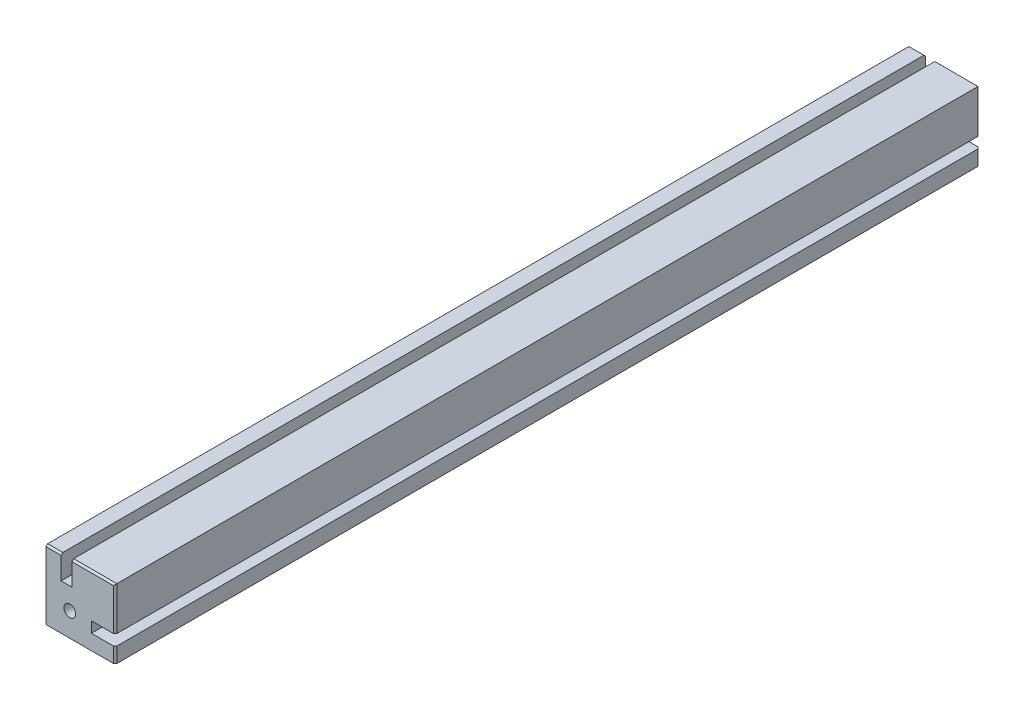
ISO-10303-21;
HEADER;
FILE_DESCRIPTION(('STEP AP214'),'2;1');
FILE_NAME('part.step','',(''),(''),'','','');
FILE_SCHEMA(('AUTOMOTIVE_DESIGN { 1 0 10303 214 1 1 1 1 }'));
ENDSEC;
DATA;
#1=APPLICATION_CONTEXT('core data for automotive mechanical design processes');
#2=APPLICATION_PROTOCOL_DEFINITION('international standard','automotive_design',2000,#1);
#3=PRODUCT_CONTEXT('',#1,'mechanical');
#4=PRODUCT('Part','Part','',(#3));
#5=PRODUCT_RELATED_PRODUCT_CATEGORY('part','',(#4));
#6=PRODUCT_DEFINITION_FORMATION('','',#4);
#7=PRODUCT_DEFINITION_CONTEXT('part definition',#1,'design');
#8=PRODUCT_DEFINITION('design','',#6,#7);
#9=PRODUCT_DEFINITION_SHAPE('','',#8);
#10=(LENGTH_UNIT() NAMED_UNIT(*) SI_UNIT(.MILLI.,.METRE.));
#11=(NAMED_UNIT(*) PLANE_ANGLE_UNIT() SI_UNIT($,.RADIAN.));
#12=(NAMED_UNIT(*) SI_UNIT($,.STERADIAN.) SOLID_ANGLE_UNIT());
#13=UNCERTAINTY_MEASURE_WITH_UNIT(LENGTH_MEASURE(1.E-05),#10,'distance_accuracy_value','');
#14=(GEOMETRIC_REPRESENTATION_CONTEXT(3) GLOBAL_UNCERTAINTY_ASSIGNED_CONTEXT((#13)) GLOBAL_UNIT_ASSIGNED_CONTEXT((#10,
#11,#12)) REPRESENTATION_CONTEXT('',''));
#15=CARTESIAN_POINT('',(0.,0.,0.));
#16=DIRECTION('',(0.,0.,1.));
#17=DIRECTION('',(1.,0.,0.));
#18=AXIS2_PLACEMENT_3D('',#15,#16,#17);
#19=CARTESIAN_POINT('',(8.,8.,200.));
#20=DIRECTION('',(-1.,0.,0.));
#21=DIRECTION('',(0.,-1.,0.));
#22=AXIS2_PLACEMENT_3D('',#19,#20,#21);
#23=PLANE('',#22);
#24=DIRECTION('',(0.,0.,1.));
#25=VECTOR('',#24,1.);
#26=CARTESIAN_POINT('',(8.,-4.5,0.));
#27=LINE('',#26,#25);
#28=CARTESIAN_POINT('',(8.,-4.5,0.400000000000012));
#29=VERTEX_POINT('',#28);
#30=CARTESIAN_POINT('',(8.,-4.5,199.6));
#31=VERTEX_POINT('',#30);
#32=EDGE_CURVE('E204',#29,#31,#27,.T.);
#33=ORIENTED_EDGE('',*,*,#32,.T.);
#34=DIRECTION('',(0.,-1.,0.));
#35=VECTOR('',#34,1.);
#36=CARTESIAN_POINT('',(8.,-8.,199.6));
#37=LINE('',#36,#35);
#38=CARTESIAN_POINT('',(8.,-8.,199.6));
#39=VERTEX_POINT('',#38);
#40=EDGE_CURVE('E286',#31,#39,#37,.T.);
#41=ORIENTED_EDGE('',*,*,#40,.T.);
#42=DIRECTION('',(0.,0.,-1.));
#43=VECTOR('',#42,1.);
#44=CARTESIAN_POINT('',(8.,-8.,200.));
#45=LINE('',#44,#43);
#46=CARTESIAN_POINT('',(8.,-8.,0.400000000000011));
#47=VERTEX_POINT('',#46);
#48=EDGE_CURVE('E253',#39,#47,#45,.T.);
#49=ORIENTED_EDGE('',*,*,#48,.T.);
#50=DIRECTION('',(0.,1.,0.));
#51=VECTOR('',#50,1.);
#52=CARTESIAN_POINT('',(8.,8.,0.400000000000011));
#53=LINE('',#52,#51);
#54=EDGE_CURVE('E283',#47,#29,#53,.T.);
#55=ORIENTED_EDGE('',*,*,#54,.T.);
#56=EDGE_LOOP('',(#33,#41,#49,#55));
#57=FACE_BOUND('',#56,.T.);
#58=ADVANCED_FACE('F34',(#57),#23,.F.);
#59=CARTESIAN_POINT('',(-8.,8.,200.));
#60=DIRECTION('',(0.,-1.,0.));
#61=DIRECTION('',(0.,0.,-1.));
#62=AXIS2_PLACEMENT_3D('',#59,#60,#61);
#63=PLANE('',#62);
#64=DIRECTION('',(0.,0.,-1.));
#65=VECTOR('',#64,1.);
#66=CARTESIAN_POINT('',(-8.,8.,200.));
#67=LINE('',#66,#65);
#68=CARTESIAN_POINT('',(-8.,8.,199.6));
#69=VERTEX_POINT('',#68);
#70=CARTESIAN_POINT('',(-8.,8.,0.400000000000011));
#71=VERTEX_POINT('',#70);
#72=EDGE_CURVE('E262',#69,#71,#67,.T.);
#73=ORIENTED_EDGE('',*,*,#72,.F.);
#74=DIRECTION('',(1.,0.,0.));
#75=VECTOR('',#74,1.);
#76=CARTESIAN_POINT('',(-4.5,8.,199.6));
#77=LINE('',#76,#75);
#78=CARTESIAN_POINT('',(-4.5,8.,199.6));
#79=VERTEX_POINT('',#78);
#80=EDGE_CURVE('E316',#69,#79,#77,.T.);
#81=ORIENTED_EDGE('',*,*,#80,.T.);
#82=DIRECTION('',(0.,0.,1.));
#83=VECTOR('',#82,1.);
#84=CARTESIAN_POINT('',(-4.5,8.,0.));
#85=LINE('',#84,#83);
#86=CARTESIAN_POINT('',(-4.5,8.,0.400000000000011));
#87=VERTEX_POINT('',#86);
#88=EDGE_CURVE('E209',#87,#79,#85,.T.);
#89=ORIENTED_EDGE('',*,*,#88,.F.);
#90=DIRECTION('',(-1.,0.,0.));
#91=VECTOR('',#90,1.);
#92=CARTESIAN_POINT('',(-8.,8.,0.400000000000011));
#93=LINE('',#92,#91);
#94=EDGE_CURVE('E313',#87,#71,#93,.T.);
#95=ORIENTED_EDGE('',*,*,#94,.T.);
#96=EDGE_LOOP('',(#73,#81,#89,#95));
#97=FACE_BOUND('',#96,.T.);
#98=ADVANCED_FACE('F389',(#97),#63,.F.);
#99=DIRECTION('',(0.,0.,-1.));
#100=VECTOR('',#99,1.);
#101=CARTESIAN_POINT('',(8.,8.,200.));
#102=LINE('',#101,#100);
#103=CARTESIAN_POINT('',(8.,8.,199.6));
#104=VERTEX_POINT('',#103);
#105=CARTESIAN_POINT('',(8.,8.,0.400000000000011));
#106=VERTEX_POINT('',#105);
#107=EDGE_CURVE('E265',#104,#106,#102,.T.);
#108=ORIENTED_EDGE('',*,*,#107,.F.);
#109=DIRECTION('',(0.,-1.,0.));
#110=VECTOR('',#109,1.);
#111=CARTESIAN_POINT('',(8.,-2.,199.6));
#112=LINE('',#111,#110);
#113=CARTESIAN_POINT('',(8.,-2.,199.6));
#114=VERTEX_POINT('',#113);
#115=EDGE_CURVE('E294',#104,#114,#112,.T.);
#116=ORIENTED_EDGE('',*,*,#115,.T.);
#117=DIRECTION('',(0.,0.,1.));
#118=VECTOR('',#117,1.);
#119=CARTESIAN_POINT('',(8.,-2.,0.));
#120=LINE('',#119,#118);
#121=CARTESIAN_POINT('',(8.,-2.,0.400000000000011));
#122=VERTEX_POINT('',#121);
#123=EDGE_CURVE('E229',#122,#114,#120,.T.);
#124=ORIENTED_EDGE('',*,*,#123,.F.);
#125=DIRECTION('',(0.,1.,0.));
#126=VECTOR('',#125,1.);
#127=CARTESIAN_POINT('',(8.,8.,0.400000000000011));
#128=LINE('',#127,#126);
#129=EDGE_CURVE('E292',#122,#106,#128,.T.);
#130=ORIENTED_EDGE('',*,*,#129,.T.);
#131=EDGE_LOOP('',(#108,#116,#124,#130));
#132=FACE_BOUND('',#131,.T.);
#133=ADVANCED_FACE('F407',(#132),#23,.F.);
#134=DIRECTION('',(0.,0.,1.));
#135=VECTOR('',#134,1.);
#136=CARTESIAN_POINT('',(-2.,8.,0.));
#137=LINE('',#136,#135);
#138=CARTESIAN_POINT('',(-2.,8.,0.400000000000011));
#139=VERTEX_POINT('',#138);
#140=CARTESIAN_POINT('',(-2.,8.,199.6));
#141=VERTEX_POINT('',#140);
#142=EDGE_CURVE('E213',#139,#141,#137,.T.);
#143=ORIENTED_EDGE('',*,*,#142,.T.);
#144=DIRECTION('',(1.,0.,0.));
#145=VECTOR('',#144,1.);
#146=CARTESIAN_POINT('',(8.,8.,199.6));
#147=LINE('',#146,#145);
#148=EDGE_CURVE('E307',#141,#104,#147,.T.);
#149=ORIENTED_EDGE('',*,*,#148,.T.);
#150=ORIENTED_EDGE('',*,*,#107,.T.);
#151=DIRECTION('',(-1.,0.,0.));
#152=VECTOR('',#151,1.);
#153=CARTESIAN_POINT('',(-8.,8.,0.400000000000011));
#154=LINE('',#153,#152);
#155=EDGE_CURVE('E304',#106,#139,#154,.T.);
#156=ORIENTED_EDGE('',*,*,#155,.T.);
#157=EDGE_LOOP('',(#143,#149,#150,#156));
#158=FACE_BOUND('',#157,.T.);
#159=ADVANCED_FACE('F403',(#158),#63,.F.);
#160=CARTESIAN_POINT('',(-8.,8.,200.));
#161=DIRECTION('',(1.,0.,0.));
#162=DIRECTION('',(0.,1.,0.));
#163=AXIS2_PLACEMENT_3D('',#160,#161,#162);
#164=PLANE('',#163);
#165=DIRECTION('',(0.,-1.,0.));
#166=VECTOR('',#165,1.);
#167=CARTESIAN_POINT('',(-8.,8.,200.));
#168=LINE('',#167,#166);
#169=CARTESIAN_POINT('',(-8.,7.59999999999999,200.));
#170=VERTEX_POINT('',#169);
#171=CARTESIAN_POINT('',(-8.,-8.,200.));
#172=VERTEX_POINT('',#171);
#173=EDGE_CURVE('E247',#170,#172,#168,.T.);
#174=ORIENTED_EDGE('',*,*,#173,.F.);
#175=DIRECTION('',(0.,0.707106781186548,-0.707106781186548));
#176=VECTOR('',#175,1.);
#177=CARTESIAN_POINT('',(-8.,7.59999999999999,200.));
#178=LINE('',#177,#176);
#179=EDGE_CURVE('E311',#170,#69,#178,.T.);
#180=ORIENTED_EDGE('',*,*,#179,.T.);
#181=ORIENTED_EDGE('',*,*,#72,.T.);
#182=DIRECTION('',(0.,0.707106781186548,0.707106781186548));
#183=VECTOR('',#182,1.);
#184=CARTESIAN_POINT('',(-8.,8.,0.400000000000011));
#185=LINE('',#184,#183);
#186=CARTESIAN_POINT('',(-8.,7.59999999999999,0.));
#187=VERTEX_POINT('',#186);
#188=EDGE_CURVE('E309',#71,#187,#185,.F.);
#189=ORIENTED_EDGE('',*,*,#188,.T.);
#190=DIRECTION('',(0.,-1.,0.));
#191=VECTOR('',#190,1.);
#192=CARTESIAN_POINT('',(-8.,8.,0.));
#193=LINE('',#192,#191);
#194=CARTESIAN_POINT('',(-8.,-8.,0.));
#195=VERTEX_POINT('',#194);
#196=EDGE_CURVE('E212',#187,#195,#193,.T.);
#197=ORIENTED_EDGE('',*,*,#196,.T.);
#198=DIRECTION('',(0.,0.,-1.));
#199=VECTOR('',#198,1.);
#200=CARTESIAN_POINT('',(-8.,-8.,200.));
#201=LINE('',#200,#199);
#202=EDGE_CURVE('E259',#172,#195,#201,.T.);
#203=ORIENTED_EDGE('',*,*,#202,.F.);
#204=EDGE_LOOP('',(#174,#180,#181,#189,#197,#203));
#205=FACE_BOUND('',#204,.T.);
#206=ADVANCED_FACE('F378',(#205),#164,.F.);
#207=CARTESIAN_POINT('',(-8.,-8.,200.));
#208=DIRECTION('',(0.,1.,0.));
#209=DIRECTION('',(0.,0.,1.));
#210=AXIS2_PLACEMENT_3D('',#207,#208,#209);
#211=PLANE('',#210);
#212=ORIENTED_EDGE('',*,*,#48,.F.);
#213=DIRECTION('',(-0.707106781186548,0.,0.707106781186548));
#214=VECTOR('',#213,1.);
#215=CARTESIAN_POINT('',(7.59999999999999,-8.,200.));
#216=LINE('',#215,#214);
#217=CARTESIAN_POINT('',(7.59999999999999,-8.,200.));
#218=VERTEX_POINT('',#217);
#219=EDGE_CURVE('E290',#39,#218,#216,.T.);
#220=ORIENTED_EDGE('',*,*,#219,.T.);
#221=DIRECTION('',(1.,0.,0.));
#222=VECTOR('',#221,1.);
#223=CARTESIAN_POINT('',(-8.,-8.,200.));
#224=LINE('',#223,#222);
#225=EDGE_CURVE('E249',#172,#218,#224,.T.);
#226=ORIENTED_EDGE('',*,*,#225,.F.);
#227=ORIENTED_EDGE('',*,*,#202,.T.);
#228=DIRECTION('',(1.,0.,0.));
#229=VECTOR('',#228,1.);
#230=CARTESIAN_POINT('',(-8.,-8.,0.));
#231=LINE('',#230,#229);
#232=CARTESIAN_POINT('',(7.59999999999999,-8.,0.));
#233=VERTEX_POINT('',#232);
#234=EDGE_CURVE('E250',#195,#233,#231,.T.);
#235=ORIENTED_EDGE('',*,*,#234,.T.);
#236=DIRECTION('',(-0.707106781186548,0.,-0.707106781186548));
#237=VECTOR('',#236,1.);
#238=CARTESIAN_POINT('',(8.,-8.,0.40000000000001));
#239=LINE('',#238,#237);
#240=EDGE_CURVE('E288',#233,#47,#239,.F.);
#241=ORIENTED_EDGE('',*,*,#240,.T.);
#242=EDGE_LOOP('',(#212,#220,#226,#227,#235,#241));
#243=FACE_BOUND('',#242,.T.);
#244=ADVANCED_FACE('F366',(#243),#211,.F.);
#245=CARTESIAN_POINT('',(0.,0.,200.));
#246=DIRECTION('',(0.,0.,1.));
#247=DIRECTION('',(1.,0.,0.));
#248=AXIS2_PLACEMENT_3D('',#245,#246,#247);
#249=PLANE('',#248);
#250=CARTESIAN_POINT('',(-2.5,-2.5,200.));
#251=DIRECTION('',(0.,0.,1.));
#252=DIRECTION('',(1.,0.,0.));
#253=AXIS2_PLACEMENT_3D('',#250,#251,#252);
#254=CIRCLE('',#253,1.34999999999999);
#255=CARTESIAN_POINT('',(-1.15000000000001,-2.5,200.));
#256=VERTEX_POINT('',#255);
#257=EDGE_CURVE('E182',#256,#256,#254,.T.);
#258=ORIENTED_EDGE('',*,*,#257,.F.);
#259=EDGE_LOOP('',(#258));
#260=FACE_BOUND('',#259,.T.);
#261=ORIENTED_EDGE('',*,*,#225,.T.);
#262=DIRECTION('',(0.,1.,0.));
#263=VECTOR('',#262,1.);
#264=CARTESIAN_POINT('',(7.59999999999999,-4.5,200.));
#265=LINE('',#264,#263);
#266=CARTESIAN_POINT('',(7.59999999999999,-4.5,200.));
#267=VERTEX_POINT('',#266);
#268=EDGE_CURVE('E276',#218,#267,#265,.T.);
#269=ORIENTED_EDGE('',*,*,#268,.T.);
#270=DIRECTION('',(1.,0.,0.));
#271=VECTOR('',#270,1.);
#272=CARTESIAN_POINT('',(8.,-4.5,200.));
#273=LINE('',#272,#271);
#274=CARTESIAN_POINT('',(2.5,-4.5,200.));
#275=VERTEX_POINT('',#274);
#276=EDGE_CURVE('E223',#275,#267,#273,.T.);
#277=ORIENTED_EDGE('',*,*,#276,.F.);
#278=DIRECTION('',(0.,-1.,0.));
#279=VECTOR('',#278,1.);
#280=CARTESIAN_POINT('',(2.5,-4.5,200.));
#281=LINE('',#280,#279);
#282=CARTESIAN_POINT('',(2.5,-2.,200.));
#283=VERTEX_POINT('',#282);
#284=EDGE_CURVE('E232',#283,#275,#281,.T.);
#285=ORIENTED_EDGE('',*,*,#284,.F.);
#286=DIRECTION('',(-1.,0.,0.));
#287=VECTOR('',#286,1.);
#288=CARTESIAN_POINT('',(8.,-2.,200.));
#289=LINE('',#288,#287);
#290=CARTESIAN_POINT('',(7.59999999999999,-2.,200.));
#291=VERTEX_POINT('',#290);
#292=EDGE_CURVE('E230',#291,#283,#289,.T.);
#293=ORIENTED_EDGE('',*,*,#292,.F.);
#294=DIRECTION('',(0.,1.,0.));
#295=VECTOR('',#294,1.);
#296=CARTESIAN_POINT('',(7.59999999999999,8.,200.));
#297=LINE('',#296,#295);
#298=CARTESIAN_POINT('',(7.59999999999999,7.59999999999999,200.));
#299=VERTEX_POINT('',#298);
#300=EDGE_CURVE('E273',#291,#299,#297,.T.);
#301=ORIENTED_EDGE('',*,*,#300,.T.);
#302=DIRECTION('',(-1.,0.,0.));
#303=VECTOR('',#302,1.);
#304=CARTESIAN_POINT('',(-2.,7.59999999999999,200.));
#305=LINE('',#304,#303);
#306=CARTESIAN_POINT('',(-2.,7.59999999999999,200.));
#307=VERTEX_POINT('',#306);
#308=EDGE_CURVE('E271',#299,#307,#305,.T.);
#309=ORIENTED_EDGE('',*,*,#308,.T.);
#310=DIRECTION('',(0.,1.,0.));
#311=VECTOR('',#310,1.);
#312=CARTESIAN_POINT('',(-2.,8.,200.));
#313=LINE('',#312,#311);
#314=CARTESIAN_POINT('',(-2.,2.5,200.));
#315=VERTEX_POINT('',#314);
#316=EDGE_CURVE('E195',#315,#307,#313,.T.);
#317=ORIENTED_EDGE('',*,*,#316,.F.);
#318=DIRECTION('',(1.,0.,0.));
#319=VECTOR('',#318,1.);
#320=CARTESIAN_POINT('',(-4.5,2.5,200.));
#321=LINE('',#320,#319);
#322=CARTESIAN_POINT('',(-4.5,2.5,200.));
#323=VERTEX_POINT('',#322);
#324=EDGE_CURVE('E203',#323,#315,#321,.T.);
#325=ORIENTED_EDGE('',*,*,#324,.F.);
#326=DIRECTION('',(0.,-1.,0.));
#327=VECTOR('',#326,1.);
#328=CARTESIAN_POINT('',(-4.5,8.,200.));
#329=LINE('',#328,#327);
#330=CARTESIAN_POINT('',(-4.5,7.59999999999999,200.));
#331=VERTEX_POINT('',#330);
#332=EDGE_CURVE('E201',#331,#323,#329,.T.);
#333=ORIENTED_EDGE('',*,*,#332,.F.);
#334=DIRECTION('',(-1.,0.,0.));
#335=VECTOR('',#334,1.);
#336=CARTESIAN_POINT('',(-8.,7.59999999999999,200.));
#337=LINE('',#336,#335);
#338=EDGE_CURVE('E268',#331,#170,#337,.T.);
#339=ORIENTED_EDGE('',*,*,#338,.T.);
#340=ORIENTED_EDGE('',*,*,#173,.T.);
#341=EDGE_LOOP('',(#261,#269,#277,#285,#293,#301,#309,#317,#325,#333,#339,#340));
#342=FACE_BOUND('',#341,.T.);
#343=ADVANCED_FACE('F352',(#260,#342),#249,.T.);
#344=CARTESIAN_POINT('',(0.,0.,0.));
#345=DIRECTION('',(0.,0.,1.));
#346=DIRECTION('',(1.,0.,0.));
#347=AXIS2_PLACEMENT_3D('',#344,#345,#346);
#348=PLANE('',#347);
#349=CARTESIAN_POINT('',(-2.5,-2.5,0.));
#350=DIRECTION('',(0.,0.,-1.));
#351=DIRECTION('',(-1.,0.,0.));
#352=AXIS2_PLACEMENT_3D('',#349,#350,#351);
#353=CIRCLE('',#352,1.34999999999999);
#354=CARTESIAN_POINT('',(-3.84999999999999,-2.5,0.));
#355=VERTEX_POINT('',#354);
#356=EDGE_CURVE('E181',#355,#355,#353,.T.);
#357=ORIENTED_EDGE('',*,*,#356,.F.);
#358=EDGE_LOOP('',(#357));
#359=FACE_BOUND('',#358,.T.);
#360=DIRECTION('',(1.,0.,0.));
#361=VECTOR('',#360,1.);
#362=CARTESIAN_POINT('',(8.,-4.5,0.));
#363=LINE('',#362,#361);
#364=CARTESIAN_POINT('',(2.5,-4.5,0.));
#365=VERTEX_POINT('',#364);
#366=CARTESIAN_POINT('',(7.59999999999999,-4.5,0.));
#367=VERTEX_POINT('',#366);
#368=EDGE_CURVE('E226',#365,#367,#363,.T.);
#369=ORIENTED_EDGE('',*,*,#368,.T.);
#370=DIRECTION('',(0.,-1.,0.));
#371=VECTOR('',#370,1.);
#372=CARTESIAN_POINT('',(7.59999999999999,0.,0.));
#373=LINE('',#372,#371);
#374=EDGE_CURVE('E11',#367,#233,#373,.T.);
#375=ORIENTED_EDGE('',*,*,#374,.T.);
#376=ORIENTED_EDGE('',*,*,#234,.F.);
#377=ORIENTED_EDGE('',*,*,#196,.F.);
#378=DIRECTION('',(1.,0.,0.));
#379=VECTOR('',#378,1.);
#380=CARTESIAN_POINT('',(0.,7.59999999999999,0.));
#381=LINE('',#380,#379);
#382=CARTESIAN_POINT('',(-4.5,7.59999999999999,0.));
#383=VERTEX_POINT('',#382);
#384=EDGE_CURVE('E58',#187,#383,#381,.T.);
#385=ORIENTED_EDGE('',*,*,#384,.T.);
#386=DIRECTION('',(0.,-1.,0.));
#387=VECTOR('',#386,1.);
#388=CARTESIAN_POINT('',(-4.5,8.,0.));
#389=LINE('',#388,#387);
#390=CARTESIAN_POINT('',(-4.5,2.5,0.));
#391=VERTEX_POINT('',#390);
#392=EDGE_CURVE('E192',#383,#391,#389,.T.);
#393=ORIENTED_EDGE('',*,*,#392,.T.);
#394=DIRECTION('',(1.,0.,0.));
#395=VECTOR('',#394,1.);
#396=CARTESIAN_POINT('',(-4.5,2.5,0.));
#397=LINE('',#396,#395);
#398=CARTESIAN_POINT('',(-2.,2.5,0.));
#399=VERTEX_POINT('',#398);
#400=EDGE_CURVE('E194',#391,#399,#397,.T.);
#401=ORIENTED_EDGE('',*,*,#400,.T.);
#402=DIRECTION('',(0.,1.,0.));
#403=VECTOR('',#402,1.);
#404=CARTESIAN_POINT('',(-2.,8.,0.));
#405=LINE('',#404,#403);
#406=CARTESIAN_POINT('',(-2.,7.59999999999999,0.));
#407=VERTEX_POINT('',#406);
#408=EDGE_CURVE('E198',#399,#407,#405,.T.);
#409=ORIENTED_EDGE('',*,*,#408,.T.);
#410=DIRECTION('',(1.,0.,0.));
#411=VECTOR('',#410,1.);
#412=CARTESIAN_POINT('',(0.,7.59999999999999,0.));
#413=LINE('',#412,#411);
#414=CARTESIAN_POINT('',(7.59999999999999,7.59999999999999,0.));
#415=VERTEX_POINT('',#414);
#416=EDGE_CURVE('E44',#407,#415,#413,.T.);
#417=ORIENTED_EDGE('',*,*,#416,.T.);
#418=DIRECTION('',(0.,-1.,0.));
#419=VECTOR('',#418,1.);
#420=CARTESIAN_POINT('',(7.59999999999999,0.,0.));
#421=LINE('',#420,#419);
#422=CARTESIAN_POINT('',(7.59999999999999,-2.,0.));
#423=VERTEX_POINT('',#422);
#424=EDGE_CURVE('E323',#415,#423,#421,.T.);
#425=ORIENTED_EDGE('',*,*,#424,.T.);
#426=DIRECTION('',(-1.,0.,0.));
#427=VECTOR('',#426,1.);
#428=CARTESIAN_POINT('',(8.,-2.,0.));
#429=LINE('',#428,#427);
#430=CARTESIAN_POINT('',(2.5,-2.,0.));
#431=VERTEX_POINT('',#430);
#432=EDGE_CURVE('E220',#423,#431,#429,.T.);
#433=ORIENTED_EDGE('',*,*,#432,.T.);
#434=DIRECTION('',(0.,-1.,0.));
#435=VECTOR('',#434,1.);
#436=CARTESIAN_POINT('',(2.5,-4.5,0.));
#437=LINE('',#436,#435);
#438=EDGE_CURVE('E222',#431,#365,#437,.T.);
#439=ORIENTED_EDGE('',*,*,#438,.T.);
#440=EDGE_LOOP('',(#369,#375,#376,#377,#385,#393,#401,#409,#417,#425,#433,#439));
#441=FACE_BOUND('',#440,.T.);
#442=ADVANCED_FACE('F340',(#359,#441),#348,.F.);
#443=CARTESIAN_POINT('',(8.,-4.5,0.));
#444=DIRECTION('',(0.,-1.,0.));
#445=DIRECTION('',(1.,0.,0.));
#446=AXIS2_PLACEMENT_3D('',#443,#444,#445);
#447=PLANE('',#446);
#448=ORIENTED_EDGE('',*,*,#276,.T.);
#449=DIRECTION('',(0.707106781186548,0.,-0.707106781186548));
#450=VECTOR('',#449,1.);
#451=CARTESIAN_POINT('',(7.59999999999999,-4.5,200.));
#452=LINE('',#451,#450);
#453=EDGE_CURVE('E281',#267,#31,#452,.T.);
#454=ORIENTED_EDGE('',*,*,#453,.T.);
#455=ORIENTED_EDGE('',*,*,#32,.F.);
#456=DIRECTION('',(0.707106781186548,0.,0.707106781186548));
#457=VECTOR('',#456,1.);
#458=CARTESIAN_POINT('',(8.,-4.5,0.400000000000011));
#459=LINE('',#458,#457);
#460=EDGE_CURVE('E279',#29,#367,#459,.F.);
#461=ORIENTED_EDGE('',*,*,#460,.T.);
#462=ORIENTED_EDGE('',*,*,#368,.F.);
#463=DIRECTION('',(0.,0.,1.));
#464=VECTOR('',#463,1.);
#465=CARTESIAN_POINT('',(2.5,-4.5,0.));
#466=LINE('',#465,#464);
#467=EDGE_CURVE('E240',#365,#275,#466,.T.);
#468=ORIENTED_EDGE('',*,*,#467,.T.);
#469=EDGE_LOOP('',(#448,#454,#455,#461,#462,#468));
#470=FACE_BOUND('',#469,.T.);
#471=ADVANCED_FACE('F355',(#470),#447,.F.);
#472=CARTESIAN_POINT('',(2.5,-4.5,0.));
#473=DIRECTION('',(-1.,0.,0.));
#474=DIRECTION('',(0.,0.,1.));
#475=AXIS2_PLACEMENT_3D('',#472,#473,#474);
#476=PLANE('',#475);
#477=ORIENTED_EDGE('',*,*,#284,.T.);
#478=ORIENTED_EDGE('',*,*,#467,.F.);
#479=ORIENTED_EDGE('',*,*,#438,.F.);
#480=DIRECTION('',(0.,0.,1.));
#481=VECTOR('',#480,1.);
#482=CARTESIAN_POINT('',(2.5,-2.,0.));
#483=LINE('',#482,#481);
#484=EDGE_CURVE('E242',#431,#283,#483,.T.);
#485=ORIENTED_EDGE('',*,*,#484,.T.);
#486=EDGE_LOOP('',(#477,#478,#479,#485));
#487=FACE_BOUND('',#486,.T.);
#488=ADVANCED_FACE('F349',(#487),#476,.F.);
#489=CARTESIAN_POINT('',(8.,-2.,0.));
#490=DIRECTION('',(0.,1.,0.));
#491=DIRECTION('',(-1.,0.,0.));
#492=AXIS2_PLACEMENT_3D('',#489,#490,#491);
#493=PLANE('',#492);
#494=ORIENTED_EDGE('',*,*,#123,.T.);
#495=DIRECTION('',(-0.707106781186548,0.,0.707106781186548));
#496=VECTOR('',#495,1.);
#497=CARTESIAN_POINT('',(7.59999999999999,-2.,200.));
#498=LINE('',#497,#496);
#499=EDGE_CURVE('E298',#114,#291,#498,.T.);
#500=ORIENTED_EDGE('',*,*,#499,.T.);
#501=ORIENTED_EDGE('',*,*,#292,.T.);
#502=ORIENTED_EDGE('',*,*,#484,.F.);
#503=ORIENTED_EDGE('',*,*,#432,.F.);
#504=DIRECTION('',(-0.707106781186548,0.,-0.707106781186548));
#505=VECTOR('',#504,1.);
#506=CARTESIAN_POINT('',(8.,-2.,0.400000000000011));
#507=LINE('',#506,#505);
#508=EDGE_CURVE('E296',#423,#122,#507,.F.);
#509=ORIENTED_EDGE('',*,*,#508,.T.);
#510=EDGE_LOOP('',(#494,#500,#501,#502,#503,#509));
#511=FACE_BOUND('',#510,.T.);
#512=ADVANCED_FACE('F344',(#511),#493,.F.);
#513=CARTESIAN_POINT('',(-4.5,8.,0.));
#514=DIRECTION('',(-1.,0.,0.));
#515=DIRECTION('',(0.,-1.,0.));
#516=AXIS2_PLACEMENT_3D('',#513,#514,#515);
#517=PLANE('',#516);
#518=ORIENTED_EDGE('',*,*,#88,.T.);
#519=DIRECTION('',(0.,-0.707106781186548,0.707106781186548));
#520=VECTOR('',#519,1.);
#521=CARTESIAN_POINT('',(-4.5,7.59999999999999,200.));
#522=LINE('',#521,#520);
#523=EDGE_CURVE('E320',#79,#331,#522,.T.);
#524=ORIENTED_EDGE('',*,*,#523,.T.);
#525=ORIENTED_EDGE('',*,*,#332,.T.);
#526=DIRECTION('',(0.,0.,1.));
#527=VECTOR('',#526,1.);
#528=CARTESIAN_POINT('',(-4.5,2.5,0.));
#529=LINE('',#528,#527);
#530=EDGE_CURVE('E200',#391,#323,#529,.T.);
#531=ORIENTED_EDGE('',*,*,#530,.F.);
#532=ORIENTED_EDGE('',*,*,#392,.F.);
#533=DIRECTION('',(0.,-0.707106781186548,-0.707106781186548));
#534=VECTOR('',#533,1.);
#535=CARTESIAN_POINT('',(-4.5,8.,0.400000000000012));
#536=LINE('',#535,#534);
#537=EDGE_CURVE('E318',#383,#87,#536,.F.);
#538=ORIENTED_EDGE('',*,*,#537,.T.);
#539=EDGE_LOOP('',(#518,#524,#525,#531,#532,#538));
#540=FACE_BOUND('',#539,.T.);
#541=ADVANCED_FACE('F384',(#540),#517,.F.);
#542=CARTESIAN_POINT('',(-2.,8.,0.));
#543=DIRECTION('',(1.,0.,0.));
#544=DIRECTION('',(0.,1.,0.));
#545=AXIS2_PLACEMENT_3D('',#542,#543,#544);
#546=PLANE('',#545);
#547=ORIENTED_EDGE('',*,*,#316,.T.);
#548=DIRECTION('',(0.,0.707106781186548,-0.707106781186548));
#549=VECTOR('',#548,1.);
#550=CARTESIAN_POINT('',(-2.,7.59999999999999,200.));
#551=LINE('',#550,#549);
#552=EDGE_CURVE('E302',#307,#141,#551,.T.);
#553=ORIENTED_EDGE('',*,*,#552,.T.);
#554=ORIENTED_EDGE('',*,*,#142,.F.);
#555=DIRECTION('',(0.,0.707106781186548,0.707106781186548));
#556=VECTOR('',#555,1.);
#557=CARTESIAN_POINT('',(-2.,8.,0.400000000000012));
#558=LINE('',#557,#556);
#559=EDGE_CURVE('E300',#139,#407,#558,.F.);
#560=ORIENTED_EDGE('',*,*,#559,.T.);
#561=ORIENTED_EDGE('',*,*,#408,.F.);
#562=DIRECTION('',(0.,0.,1.));
#563=VECTOR('',#562,1.);
#564=CARTESIAN_POINT('',(-2.,2.5,0.));
#565=LINE('',#564,#563);
#566=EDGE_CURVE('E216',#399,#315,#565,.T.);
#567=ORIENTED_EDGE('',*,*,#566,.T.);
#568=EDGE_LOOP('',(#547,#553,#554,#560,#561,#567));
#569=FACE_BOUND('',#568,.T.);
#570=ADVANCED_FACE('F400',(#569),#546,.F.);
#571=CARTESIAN_POINT('',(-4.5,2.5,0.));
#572=DIRECTION('',(0.,-1.,0.));
#573=DIRECTION('',(0.,0.,-1.));
#574=AXIS2_PLACEMENT_3D('',#571,#572,#573);
#575=PLANE('',#574);
#576=ORIENTED_EDGE('',*,*,#324,.T.);
#577=ORIENTED_EDGE('',*,*,#566,.F.);
#578=ORIENTED_EDGE('',*,*,#400,.F.);
#579=ORIENTED_EDGE('',*,*,#530,.T.);
#580=EDGE_LOOP('',(#576,#577,#578,#579));
#581=FACE_BOUND('',#580,.T.);
#582=ADVANCED_FACE('F397',(#581),#575,.F.);
#583=CARTESIAN_POINT('',(7.59999999999999,0.,200.));
#584=DIRECTION('',(0.707106781186548,0.,0.707106781186548));
#585=DIRECTION('',(0.,-1.,0.));
#586=AXIS2_PLACEMENT_3D('',#583,#584,#585);
#587=PLANE('',#586);
#588=ORIENTED_EDGE('',*,*,#219,.F.);
#589=ORIENTED_EDGE('',*,*,#40,.F.);
#590=ORIENTED_EDGE('',*,*,#453,.F.);
#591=ORIENTED_EDGE('',*,*,#268,.F.);
#592=EDGE_LOOP('',(#588,#589,#590,#591));
#593=FACE_BOUND('',#592,.T.);
#594=ADVANCED_FACE('F371',(#593),#587,.T.);
#595=CARTESIAN_POINT('',(0.,7.59999999999999,200.));
#596=DIRECTION('',(0.,0.707106781186548,0.707106781186548));
#597=DIRECTION('',(1.,0.,0.));
#598=AXIS2_PLACEMENT_3D('',#595,#596,#597);
#599=PLANE('',#598);
#600=ORIENTED_EDGE('',*,*,#552,.F.);
#601=ORIENTED_EDGE('',*,*,#308,.F.);
#602=DIRECTION('',(0.577350269189626,0.577350269189626,-0.577350269189626));
#603=VECTOR('',#602,1.);
#604=CARTESIAN_POINT('',(5.06666666666666,5.06666666666666,202.533333333333));
#605=LINE('',#604,#603);
#606=EDGE_CURVE('E233',#104,#299,#605,.F.);
#607=ORIENTED_EDGE('',*,*,#606,.F.);
#608=ORIENTED_EDGE('',*,*,#148,.F.);
#609=EDGE_LOOP('',(#600,#601,#607,#608));
#610=FACE_BOUND('',#609,.T.);
#611=ADVANCED_FACE('F412',(#610),#599,.T.);
#612=CARTESIAN_POINT('',(7.59999999999999,0.,200.));
#613=DIRECTION('',(0.707106781186548,0.,0.707106781186548));
#614=DIRECTION('',(0.,-1.,0.));
#615=AXIS2_PLACEMENT_3D('',#612,#613,#614);
#616=PLANE('',#615);
#617=ORIENTED_EDGE('',*,*,#499,.F.);
#618=ORIENTED_EDGE('',*,*,#115,.F.);
#619=ORIENTED_EDGE('',*,*,#606,.T.);
#620=ORIENTED_EDGE('',*,*,#300,.F.);
#621=EDGE_LOOP('',(#617,#618,#619,#620));
#622=FACE_BOUND('',#621,.T.);
#623=ADVANCED_FACE('F409',(#622),#616,.T.);
#624=CARTESIAN_POINT('',(0.,7.59999999999999,200.));
#625=DIRECTION('',(0.,0.707106781186548,0.707106781186548));
#626=DIRECTION('',(1.,0.,0.));
#627=AXIS2_PLACEMENT_3D('',#624,#625,#626);
#628=PLANE('',#627);
#629=ORIENTED_EDGE('',*,*,#523,.F.);
#630=ORIENTED_EDGE('',*,*,#80,.F.);
#631=ORIENTED_EDGE('',*,*,#179,.F.);
#632=ORIENTED_EDGE('',*,*,#338,.F.);
#633=EDGE_LOOP('',(#629,#630,#631,#632));
#634=FACE_BOUND('',#633,.T.);
#635=ADVANCED_FACE('F392',(#634),#628,.T.);
#636=CARTESIAN_POINT('',(8.,8.,0.400000000000011));
#637=DIRECTION('',(-0.707106781186548,0.,0.707106781186548));
#638=DIRECTION('',(0.,1.,0.));
#639=AXIS2_PLACEMENT_3D('',#636,#637,#638);
#640=PLANE('',#639);
#641=ORIENTED_EDGE('',*,*,#240,.F.);
#642=ORIENTED_EDGE('',*,*,#374,.F.);
#643=ORIENTED_EDGE('',*,*,#460,.F.);
#644=ORIENTED_EDGE('',*,*,#54,.F.);
#645=EDGE_LOOP('',(#641,#642,#643,#644));
#646=FACE_BOUND('',#645,.T.);
#647=ADVANCED_FACE('F362',(#646),#640,.F.);
#648=CARTESIAN_POINT('',(8.,8.,0.400000000000011));
#649=DIRECTION('',(-0.707106781186548,0.,0.707106781186548));
#650=DIRECTION('',(0.,1.,0.));
#651=AXIS2_PLACEMENT_3D('',#648,#649,#650);
#652=PLANE('',#651);
#653=ORIENTED_EDGE('',*,*,#508,.F.);
#654=ORIENTED_EDGE('',*,*,#424,.F.);
#655=DIRECTION('',(0.577350269189626,0.577350269189626,0.577350269189626));
#656=VECTOR('',#655,1.);
#657=CARTESIAN_POINT('',(8.,8.,0.400000000000011));
#658=LINE('',#657,#656);
#659=EDGE_CURVE('E39',#106,#415,#658,.F.);
#660=ORIENTED_EDGE('',*,*,#659,.F.);
#661=ORIENTED_EDGE('',*,*,#129,.F.);
#662=EDGE_LOOP('',(#653,#654,#660,#661));
#663=FACE_BOUND('',#662,.T.);
#664=ADVANCED_FACE('F338',(#663),#652,.F.);
#665=CARTESIAN_POINT('',(-8.,8.,0.400000000000011));
#666=DIRECTION('',(0.,-0.707106781186548,0.707106781186548));
#667=DIRECTION('',(-1.,0.,0.));
#668=AXIS2_PLACEMENT_3D('',#665,#666,#667);
#669=PLANE('',#668);
#670=ORIENTED_EDGE('',*,*,#659,.T.);
#671=ORIENTED_EDGE('',*,*,#416,.F.);
#672=ORIENTED_EDGE('',*,*,#559,.F.);
#673=ORIENTED_EDGE('',*,*,#155,.F.);
#674=EDGE_LOOP('',(#670,#671,#672,#673));
#675=FACE_BOUND('',#674,.T.);
#676=ADVANCED_FACE('F334',(#675),#669,.F.);
#677=CARTESIAN_POINT('',(-8.,8.,0.400000000000011));
#678=DIRECTION('',(0.,-0.707106781186548,0.707106781186548));
#679=DIRECTION('',(-1.,0.,0.));
#680=AXIS2_PLACEMENT_3D('',#677,#678,#679);
#681=PLANE('',#680);
#682=ORIENTED_EDGE('',*,*,#537,.F.);
#683=ORIENTED_EDGE('',*,*,#384,.F.);
#684=ORIENTED_EDGE('',*,*,#188,.F.);
#685=ORIENTED_EDGE('',*,*,#94,.F.);
#686=EDGE_LOOP('',(#682,#683,#684,#685));
#687=FACE_BOUND('',#686,.T.);
#688=ADVANCED_FACE('F37',(#687),#681,.F.);
#689=CARTESIAN_POINT('',(-2.5,-2.5,14.1888381643128));
#690=DIRECTION('',(0.,0.,-1.));
#691=DIRECTION('',(-1.,0.,0.));
#692=AXIS2_PLACEMENT_3D('',#689,#690,#691);
#693=CONICAL_SURFACE('',#692,1.35,1.02974425867665);
#694=CARTESIAN_POINT('',(-2.50000000000001,-2.5,15.));
#695=VERTEX_POINT('',#694);
#696=VERTEX_LOOP('',#695);
#697=FACE_BOUND('',#696,.T.);
#698=CARTESIAN_POINT('',(-2.5,-2.5,14.1888381643128));
#699=DIRECTION('',(0.,0.,-1.));
#700=DIRECTION('',(-1.,0.,0.));
#701=AXIS2_PLACEMENT_3D('',#698,#699,#700);
#702=CIRCLE('',#701,1.35);
#703=CARTESIAN_POINT('',(-3.85,-2.5,14.1888381643128));
#704=VERTEX_POINT('',#703);
#705=EDGE_CURVE('E185',#704,#704,#702,.T.);
#706=ORIENTED_EDGE('',*,*,#705,.T.);
#707=EDGE_LOOP('',(#706));
#708=FACE_BOUND('',#707,.T.);
#709=ADVANCED_FACE('F458',(#697,#708),#693,.F.);
#710=CARTESIAN_POINT('',(-2.5,-2.5,0.));
#711=DIRECTION('',(0.,0.,-1.));
#712=DIRECTION('',(-1.,0.,0.));
#713=AXIS2_PLACEMENT_3D('',#710,#711,#712);
#714=CYLINDRICAL_SURFACE('',#713,1.34999999999999);
#715=ORIENTED_EDGE('',*,*,#705,.F.);
#716=EDGE_LOOP('',(#715));
#717=FACE_BOUND('',#716,.T.);
#718=ORIENTED_EDGE('',*,*,#356,.T.);
#719=EDGE_LOOP('',(#718));
#720=FACE_BOUND('',#719,.T.);
#721=ADVANCED_FACE('F175',(#717,#720),#714,.F.);
#722=CARTESIAN_POINT('',(-2.5,-2.5,185.811161835687));
#723=DIRECTION('',(0.,0.,1.));
#724=DIRECTION('',(1.,0.,0.));
#725=AXIS2_PLACEMENT_3D('',#722,#723,#724);
#726=CONICAL_SURFACE('',#725,1.35,1.02974425867665);
#727=CARTESIAN_POINT('',(-2.50000000000001,-2.5,185.));
#728=VERTEX_POINT('',#727);
#729=VERTEX_LOOP('',#728);
#730=FACE_BOUND('',#729,.T.);
#731=CARTESIAN_POINT('',(-2.5,-2.5,185.811161835687));
#732=DIRECTION('',(0.,0.,1.));
#733=DIRECTION('',(1.,0.,0.));
#734=AXIS2_PLACEMENT_3D('',#731,#732,#733);
#735=CIRCLE('',#734,1.35);
#736=CARTESIAN_POINT('',(-1.15,-2.5,185.811161835687));
#737=VERTEX_POINT('',#736);
#738=EDGE_CURVE('E179',#737,#737,#735,.T.);
#739=ORIENTED_EDGE('',*,*,#738,.T.);
#740=EDGE_LOOP('',(#739));
#741=FACE_BOUND('',#740,.T.);
#742=ADVANCED_FACE('F171',(#730,#741),#726,.F.);
#743=CARTESIAN_POINT('',(-2.5,-2.5,200.));
#744=DIRECTION('',(0.,0.,1.));
#745=DIRECTION('',(1.,0.,0.));
#746=AXIS2_PLACEMENT_3D('',#743,#744,#745);
#747=CYLINDRICAL_SURFACE('',#746,1.34999999999999);
#748=ORIENTED_EDGE('',*,*,#738,.F.);
#749=EDGE_LOOP('',(#748));
#750=FACE_BOUND('',#749,.T.);
#751=ORIENTED_EDGE('',*,*,#257,.T.);
#752=EDGE_LOOP('',(#751));
#753=FACE_BOUND('',#752,.T.);
#754=ADVANCED_FACE('F174',(#750,#753),#747,.F.);
#755=CLOSED_SHELL('',(#58,#98,#133,#159,#206,#244,#343,#442,#471,#488,#512,#541,#570,#582,#594,
#611,#623,#635,#647,#664,#676,#688,#709,#721,#742,#754));
#756=MANIFOLD_SOLID_BREP('B2',#755);
#757=ADVANCED_BREP_SHAPE_REPRESENTATION('',(#18,#756),#14);
#758=SHAPE_DEFINITION_REPRESENTATION(#9,#757);
ENDSEC;
END-ISO-10303-21;
